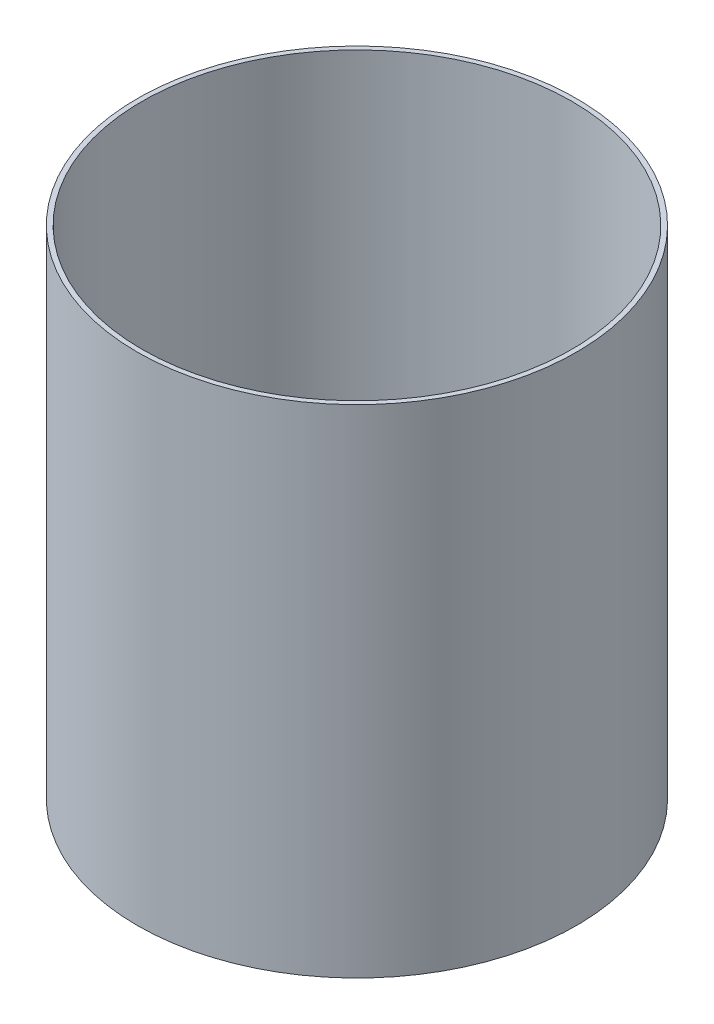
ISO-10303-21;
HEADER;
FILE_DESCRIPTION(('STEP AP214'),'2;1');
FILE_NAME('part.step','',(''),(''),'','','');
FILE_SCHEMA(('AUTOMOTIVE_DESIGN { 1 0 10303 214 1 1 1 1 }'));
ENDSEC;
DATA;
#1=APPLICATION_CONTEXT('core data for automotive mechanical design processes');
#2=APPLICATION_PROTOCOL_DEFINITION('international standard','automotive_design',2000,#1);
#3=PRODUCT_CONTEXT('',#1,'mechanical');
#4=PRODUCT('Part','Part','',(#3));
#5=PRODUCT_RELATED_PRODUCT_CATEGORY('part','',(#4));
#6=PRODUCT_DEFINITION_FORMATION('','',#4);
#7=PRODUCT_DEFINITION_CONTEXT('part definition',#1,'design');
#8=PRODUCT_DEFINITION('design','',#6,#7);
#9=PRODUCT_DEFINITION_SHAPE('','',#8);
#10=(LENGTH_UNIT() NAMED_UNIT(*) SI_UNIT(.MILLI.,.METRE.));
#11=(NAMED_UNIT(*) PLANE_ANGLE_UNIT() SI_UNIT($,.RADIAN.));
#12=(NAMED_UNIT(*) SI_UNIT($,.STERADIAN.) SOLID_ANGLE_UNIT());
#13=UNCERTAINTY_MEASURE_WITH_UNIT(LENGTH_MEASURE(1.E-05),#10,'distance_accuracy_value','');
#14=(GEOMETRIC_REPRESENTATION_CONTEXT(3) GLOBAL_UNCERTAINTY_ASSIGNED_CONTEXT((#13)) GLOBAL_UNIT_ASSIGNED_CONTEXT((#10,
#11,#12)) REPRESENTATION_CONTEXT('',''));
#15=CARTESIAN_POINT('',(0.,0.,0.));
#16=DIRECTION('',(0.,0.,1.));
#17=DIRECTION('',(1.,0.,0.));
#18=AXIS2_PLACEMENT_3D('',#15,#16,#17);
#19=CARTESIAN_POINT('',(0.,780.,0.));
#20=DIRECTION('',(0.,-1.,0.));
#21=DIRECTION('',(0.,0.,-1.));
#22=AXIS2_PLACEMENT_3D('',#19,#20,#21);
#23=CYLINDRICAL_SURFACE('',#22,690.);
#24=CARTESIAN_POINT('',(0.,780.,0.));
#25=DIRECTION('',(0.,1.,0.));
#26=DIRECTION('',(0.,0.,1.));
#27=AXIS2_PLACEMENT_3D('',#24,#25,#26);
#28=CIRCLE('',#27,690.);
#29=CARTESIAN_POINT('',(0.,780.,690.));
#30=VERTEX_POINT('',#29);
#31=EDGE_CURVE('E10',#30,#30,#28,.T.);
#32=ORIENTED_EDGE('',*,*,#31,.F.);
#33=EDGE_LOOP('',(#32));
#34=FACE_BOUND('',#33,.T.);
#35=CARTESIAN_POINT('',(0.,-780.,0.));
#36=DIRECTION('',(0.,1.,0.));
#37=DIRECTION('',(0.,0.,1.));
#38=AXIS2_PLACEMENT_3D('',#35,#36,#37);
#39=CIRCLE('',#38,690.);
#40=CARTESIAN_POINT('',(0.,-780.,690.));
#41=VERTEX_POINT('',#40);
#42=EDGE_CURVE('E40',#41,#41,#39,.T.);
#43=ORIENTED_EDGE('',*,*,#42,.T.);
#44=EDGE_LOOP('',(#43));
#45=FACE_BOUND('',#44,.T.);
#46=ADVANCED_FACE('F37',(#34,#45),#23,.T.);
#47=CARTESIAN_POINT('',(0.,780.,0.));
#48=DIRECTION('',(0.,1.,0.));
#49=DIRECTION('',(0.,0.,1.));
#50=AXIS2_PLACEMENT_3D('',#47,#48,#49);
#51=PLANE('',#50);
#52=CARTESIAN_POINT('',(0.,780.,0.));
#53=DIRECTION('',(0.,1.,0.));
#54=DIRECTION('',(0.,0.,1.));
#55=AXIS2_PLACEMENT_3D('',#52,#53,#54);
#56=CIRCLE('',#55,675.);
#57=CARTESIAN_POINT('',(0.,780.,675.));
#58=VERTEX_POINT('',#57);
#59=EDGE_CURVE('E51',#58,#58,#56,.T.);
#60=ORIENTED_EDGE('',*,*,#59,.F.);
#61=EDGE_LOOP('',(#60));
#62=FACE_BOUND('',#61,.T.);
#63=ORIENTED_EDGE('',*,*,#31,.T.);
#64=EDGE_LOOP('',(#63));
#65=FACE_BOUND('',#64,.T.);
#66=ADVANCED_FACE('F57',(#62,#65),#51,.T.);
#67=CARTESIAN_POINT('',(0.,-780.,0.));
#68=DIRECTION('',(0.,1.,0.));
#69=DIRECTION('',(0.,0.,1.));
#70=AXIS2_PLACEMENT_3D('',#67,#68,#69);
#71=PLANE('',#70);
#72=CARTESIAN_POINT('',(0.,-780.,0.));
#73=DIRECTION('',(0.,1.,0.));
#74=DIRECTION('',(0.,0.,1.));
#75=AXIS2_PLACEMENT_3D('',#72,#73,#74);
#76=CIRCLE('',#75,675.);
#77=CARTESIAN_POINT('',(0.,-780.,675.));
#78=VERTEX_POINT('',#77);
#79=EDGE_CURVE('E47',#78,#78,#76,.T.);
#80=ORIENTED_EDGE('',*,*,#79,.T.);
#81=EDGE_LOOP('',(#80));
#82=FACE_BOUND('',#81,.T.);
#83=ORIENTED_EDGE('',*,*,#42,.F.);
#84=EDGE_LOOP('',(#83));
#85=FACE_BOUND('',#84,.T.);
#86=ADVANCED_FACE('F59',(#82,#85),#71,.F.);
#87=CARTESIAN_POINT('',(0.,-780.,0.));
#88=DIRECTION('',(0.,1.,0.));
#89=DIRECTION('',(0.,0.,1.));
#90=AXIS2_PLACEMENT_3D('',#87,#88,#89);
#91=CYLINDRICAL_SURFACE('',#90,675.);
#92=ORIENTED_EDGE('',*,*,#79,.F.);
#93=EDGE_LOOP('',(#92));
#94=FACE_BOUND('',#93,.T.);
#95=ORIENTED_EDGE('',*,*,#59,.T.);
#96=EDGE_LOOP('',(#95));
#97=FACE_BOUND('',#96,.T.);
#98=ADVANCED_FACE('F55',(#94,#97),#91,.F.);
#99=CLOSED_SHELL('',(#46,#66,#86,#98));
#100=MANIFOLD_SOLID_BREP('B2',#99);
#101=ADVANCED_BREP_SHAPE_REPRESENTATION('',(#18,#100),#14);
#102=SHAPE_DEFINITION_REPRESENTATION(#9,#101);
ENDSEC;
END-ISO-10303-21;
